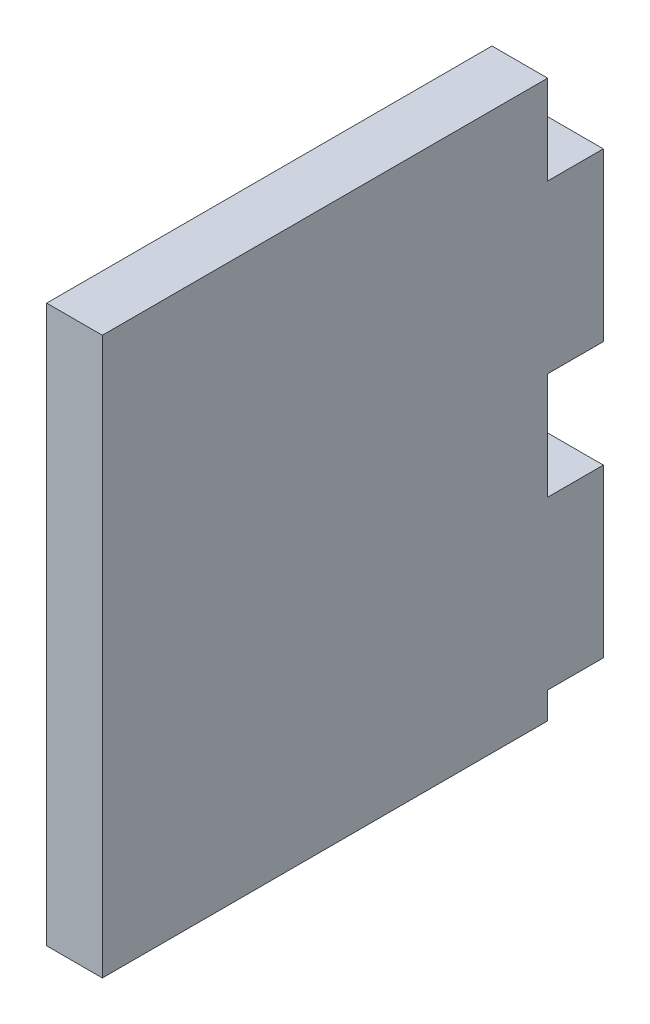
ISO-10303-21;
HEADER;
FILE_DESCRIPTION(('STEP AP214'),'2;1');
FILE_NAME('part.step','',(''),(''),'','','');
FILE_SCHEMA(('AUTOMOTIVE_DESIGN { 1 0 10303 214 1 1 1 1 }'));
ENDSEC;
DATA;
#1=APPLICATION_CONTEXT('core data for automotive mechanical design processes');
#2=APPLICATION_PROTOCOL_DEFINITION('international standard','automotive_design',2000,#1);
#3=PRODUCT_CONTEXT('',#1,'mechanical');
#4=PRODUCT('Part','Part','',(#3));
#5=PRODUCT_RELATED_PRODUCT_CATEGORY('part','',(#4));
#6=PRODUCT_DEFINITION_FORMATION('','',#4);
#7=PRODUCT_DEFINITION_CONTEXT('part definition',#1,'design');
#8=PRODUCT_DEFINITION('design','',#6,#7);
#9=PRODUCT_DEFINITION_SHAPE('','',#8);
#10=(LENGTH_UNIT() NAMED_UNIT(*) SI_UNIT(.MILLI.,.METRE.));
#11=(NAMED_UNIT(*) PLANE_ANGLE_UNIT() SI_UNIT($,.RADIAN.));
#12=(NAMED_UNIT(*) SI_UNIT($,.STERADIAN.) SOLID_ANGLE_UNIT());
#13=UNCERTAINTY_MEASURE_WITH_UNIT(LENGTH_MEASURE(1.E-05),#10,'distance_accuracy_value','');
#14=(GEOMETRIC_REPRESENTATION_CONTEXT(3) GLOBAL_UNCERTAINTY_ASSIGNED_CONTEXT((#13)) GLOBAL_UNIT_ASSIGNED_CONTEXT((#10,
#11,#12)) REPRESENTATION_CONTEXT('',''));
#15=CARTESIAN_POINT('',(0.,0.,0.));
#16=DIRECTION('',(0.,0.,1.));
#17=DIRECTION('',(1.,0.,0.));
#18=AXIS2_PLACEMENT_3D('',#15,#16,#17);
#19=CARTESIAN_POINT('',(5.,0.,-40.));
#20=DIRECTION('',(0.,0.,-1.));
#21=DIRECTION('',(0.,1.,0.));
#22=AXIS2_PLACEMENT_3D('',#19,#20,#21);
#23=PLANE('',#22);
#24=DIRECTION('',(0.,-1.,0.));
#25=VECTOR('',#24,1.);
#26=CARTESIAN_POINT('',(0.,0.,-40.));
#27=LINE('',#26,#25);
#28=CARTESIAN_POINT('',(0.,0.,-40.));
#29=VERTEX_POINT('',#28);
#30=CARTESIAN_POINT('',(0.,-8.,-40.));
#31=VERTEX_POINT('',#30);
#32=EDGE_CURVE('E164',#29,#31,#27,.T.);
#33=ORIENTED_EDGE('',*,*,#32,.F.);
#34=DIRECTION('',(-1.,0.,0.));
#35=VECTOR('',#34,1.);
#36=CARTESIAN_POINT('',(5.,0.,-40.));
#37=LINE('',#36,#35);
#38=CARTESIAN_POINT('',(5.,0.,-40.));
#39=VERTEX_POINT('',#38);
#40=EDGE_CURVE('E11',#39,#29,#37,.T.);
#41=ORIENTED_EDGE('',*,*,#40,.F.);
#42=DIRECTION('',(0.,-1.,0.));
#43=VECTOR('',#42,1.);
#44=CARTESIAN_POINT('',(5.,0.,-40.));
#45=LINE('',#44,#43);
#46=CARTESIAN_POINT('',(5.,-8.,-40.));
#47=VERTEX_POINT('',#46);
#48=EDGE_CURVE('E201',#39,#47,#45,.T.);
#49=ORIENTED_EDGE('',*,*,#48,.T.);
#50=DIRECTION('',(-1.,0.,0.));
#51=VECTOR('',#50,1.);
#52=CARTESIAN_POINT('',(5.,-8.,-40.));
#53=LINE('',#52,#51);
#54=EDGE_CURVE('E59',#47,#31,#53,.T.);
#55=ORIENTED_EDGE('',*,*,#54,.T.);
#56=EDGE_LOOP('',(#33,#41,#49,#55));
#57=FACE_BOUND('',#56,.T.);
#58=ADVANCED_FACE('F41',(#57),#23,.T.);
#59=CARTESIAN_POINT('',(5.,0.,0.));
#60=DIRECTION('',(0.,1.,0.));
#61=DIRECTION('',(0.,0.,1.));
#62=AXIS2_PLACEMENT_3D('',#59,#60,#61);
#63=PLANE('',#62);
#64=DIRECTION('',(0.,0.,-1.));
#65=VECTOR('',#64,1.);
#66=CARTESIAN_POINT('',(0.,0.,0.));
#67=LINE('',#66,#65);
#68=CARTESIAN_POINT('',(0.,0.,0.));
#69=VERTEX_POINT('',#68);
#70=EDGE_CURVE('E167',#69,#29,#67,.T.);
#71=ORIENTED_EDGE('',*,*,#70,.F.);
#72=DIRECTION('',(-1.,0.,0.));
#73=VECTOR('',#72,1.);
#74=CARTESIAN_POINT('',(5.,0.,0.));
#75=LINE('',#74,#73);
#76=CARTESIAN_POINT('',(5.,0.,0.));
#77=VERTEX_POINT('',#76);
#78=EDGE_CURVE('E51',#77,#69,#75,.T.);
#79=ORIENTED_EDGE('',*,*,#78,.F.);
#80=DIRECTION('',(0.,0.,-1.));
#81=VECTOR('',#80,1.);
#82=CARTESIAN_POINT('',(5.,0.,0.));
#83=LINE('',#82,#81);
#84=EDGE_CURVE('E241',#77,#39,#83,.T.);
#85=ORIENTED_EDGE('',*,*,#84,.T.);
#86=ORIENTED_EDGE('',*,*,#40,.T.);
#87=EDGE_LOOP('',(#71,#79,#85,#86));
#88=FACE_BOUND('',#87,.T.);
#89=ADVANCED_FACE('F43',(#88),#63,.T.);
#90=CARTESIAN_POINT('',(5.,0.,0.));
#91=DIRECTION('',(0.,0.,-1.));
#92=DIRECTION('',(-1.,0.,0.));
#93=AXIS2_PLACEMENT_3D('',#90,#91,#92);
#94=PLANE('',#93);
#95=DIRECTION('',(0.,-1.,0.));
#96=VECTOR('',#95,1.);
#97=CARTESIAN_POINT('',(0.,0.,0.));
#98=LINE('',#97,#96);
#99=CARTESIAN_POINT('',(0.,-50.,0.));
#100=VERTEX_POINT('',#99);
#101=EDGE_CURVE('E173',#69,#100,#98,.T.);
#102=ORIENTED_EDGE('',*,*,#101,.T.);
#103=DIRECTION('',(-1.,0.,0.));
#104=VECTOR('',#103,1.);
#105=CARTESIAN_POINT('',(5.,-50.,0.));
#106=LINE('',#105,#104);
#107=CARTESIAN_POINT('',(5.,-50.,0.));
#108=VERTEX_POINT('',#107);
#109=EDGE_CURVE('E223',#108,#100,#106,.T.);
#110=ORIENTED_EDGE('',*,*,#109,.F.);
#111=DIRECTION('',(0.,-1.,0.));
#112=VECTOR('',#111,1.);
#113=CARTESIAN_POINT('',(5.,0.,0.));
#114=LINE('',#113,#112);
#115=EDGE_CURVE('E232',#77,#108,#114,.T.);
#116=ORIENTED_EDGE('',*,*,#115,.F.);
#117=ORIENTED_EDGE('',*,*,#78,.T.);
#118=EDGE_LOOP('',(#102,#110,#116,#117));
#119=FACE_BOUND('',#118,.T.);
#120=ADVANCED_FACE('F230',(#119),#94,.F.);
#121=CARTESIAN_POINT('',(5.,-50.,0.));
#122=DIRECTION('',(0.,1.,0.));
#123=DIRECTION('',(0.,0.,1.));
#124=AXIS2_PLACEMENT_3D('',#121,#122,#123);
#125=PLANE('',#124);
#126=DIRECTION('',(0.,0.,-1.));
#127=VECTOR('',#126,1.);
#128=CARTESIAN_POINT('',(0.,-50.,0.));
#129=LINE('',#128,#127);
#130=CARTESIAN_POINT('',(0.,-50.,-40.));
#131=VERTEX_POINT('',#130);
#132=EDGE_CURVE('E176',#100,#131,#129,.T.);
#133=ORIENTED_EDGE('',*,*,#132,.T.);
#134=DIRECTION('',(-1.,0.,0.));
#135=VECTOR('',#134,1.);
#136=CARTESIAN_POINT('',(5.,-50.,-40.));
#137=LINE('',#136,#135);
#138=CARTESIAN_POINT('',(5.,-50.,-40.));
#139=VERTEX_POINT('',#138);
#140=EDGE_CURVE('E220',#139,#131,#137,.T.);
#141=ORIENTED_EDGE('',*,*,#140,.F.);
#142=DIRECTION('',(0.,0.,-1.));
#143=VECTOR('',#142,1.);
#144=CARTESIAN_POINT('',(5.,-50.,0.));
#145=LINE('',#144,#143);
#146=EDGE_CURVE('E288',#108,#139,#145,.T.);
#147=ORIENTED_EDGE('',*,*,#146,.F.);
#148=ORIENTED_EDGE('',*,*,#109,.T.);
#149=EDGE_LOOP('',(#133,#141,#147,#148));
#150=FACE_BOUND('',#149,.T.);
#151=ADVANCED_FACE('F263',(#150),#125,.F.);
#152=CARTESIAN_POINT('',(0.,-47.6,-40.));
#153=VERTEX_POINT('',#152);
#154=EDGE_CURVE('E169',#153,#131,#27,.T.);
#155=ORIENTED_EDGE('',*,*,#154,.F.);
#156=DIRECTION('',(-1.,0.,0.));
#157=VECTOR('',#156,1.);
#158=CARTESIAN_POINT('',(5.,-47.6,-40.));
#159=LINE('',#158,#157);
#160=CARTESIAN_POINT('',(5.,-47.6,-40.));
#161=VERTEX_POINT('',#160);
#162=EDGE_CURVE('E217',#161,#153,#159,.T.);
#163=ORIENTED_EDGE('',*,*,#162,.F.);
#164=EDGE_CURVE('E285',#161,#139,#45,.T.);
#165=ORIENTED_EDGE('',*,*,#164,.T.);
#166=ORIENTED_EDGE('',*,*,#140,.T.);
#167=EDGE_LOOP('',(#155,#163,#165,#166));
#168=FACE_BOUND('',#167,.T.);
#169=ADVANCED_FACE('F254',(#168),#23,.T.);
#170=CARTESIAN_POINT('',(5.,-47.6,0.));
#171=DIRECTION('',(0.,1.,0.));
#172=DIRECTION('',(0.,0.,1.));
#173=AXIS2_PLACEMENT_3D('',#170,#171,#172);
#174=PLANE('',#173);
#175=DIRECTION('',(0.,0.,-1.));
#176=VECTOR('',#175,1.);
#177=CARTESIAN_POINT('',(0.,-47.6,0.));
#178=LINE('',#177,#176);
#179=CARTESIAN_POINT('',(0.,-47.6,-45.));
#180=VERTEX_POINT('',#179);
#181=EDGE_CURVE('E180',#153,#180,#178,.T.);
#182=ORIENTED_EDGE('',*,*,#181,.T.);
#183=DIRECTION('',(-1.,0.,0.));
#184=VECTOR('',#183,1.);
#185=CARTESIAN_POINT('',(5.,-47.6,-45.));
#186=LINE('',#185,#184);
#187=CARTESIAN_POINT('',(5.,-47.6,-45.));
#188=VERTEX_POINT('',#187);
#189=EDGE_CURVE('E214',#188,#180,#186,.T.);
#190=ORIENTED_EDGE('',*,*,#189,.F.);
#191=DIRECTION('',(0.,0.,-1.));
#192=VECTOR('',#191,1.);
#193=CARTESIAN_POINT('',(5.,-47.6,0.));
#194=LINE('',#193,#192);
#195=EDGE_CURVE('E293',#161,#188,#194,.T.);
#196=ORIENTED_EDGE('',*,*,#195,.F.);
#197=ORIENTED_EDGE('',*,*,#162,.T.);
#198=EDGE_LOOP('',(#182,#190,#196,#197));
#199=FACE_BOUND('',#198,.T.);
#200=ADVANCED_FACE('F262',(#199),#174,.F.);
#201=CARTESIAN_POINT('',(5.,0.,-45.));
#202=DIRECTION('',(0.,0.,-1.));
#203=DIRECTION('',(0.,1.,0.));
#204=AXIS2_PLACEMENT_3D('',#201,#202,#203);
#205=PLANE('',#204);
#206=DIRECTION('',(0.,-1.,0.));
#207=VECTOR('',#206,1.);
#208=CARTESIAN_POINT('',(0.,0.,-45.));
#209=LINE('',#208,#207);
#210=CARTESIAN_POINT('',(0.,-32.6,-45.));
#211=VERTEX_POINT('',#210);
#212=EDGE_CURVE('E184',#211,#180,#209,.T.);
#213=ORIENTED_EDGE('',*,*,#212,.F.);
#214=DIRECTION('',(-1.,0.,0.));
#215=VECTOR('',#214,1.);
#216=CARTESIAN_POINT('',(5.,-32.6,-45.));
#217=LINE('',#216,#215);
#218=CARTESIAN_POINT('',(5.,-32.6,-45.));
#219=VERTEX_POINT('',#218);
#220=EDGE_CURVE('E211',#219,#211,#217,.T.);
#221=ORIENTED_EDGE('',*,*,#220,.F.);
#222=DIRECTION('',(0.,-1.,0.));
#223=VECTOR('',#222,1.);
#224=CARTESIAN_POINT('',(5.,0.,-45.));
#225=LINE('',#224,#223);
#226=EDGE_CURVE('E300',#219,#188,#225,.T.);
#227=ORIENTED_EDGE('',*,*,#226,.T.);
#228=ORIENTED_EDGE('',*,*,#189,.T.);
#229=EDGE_LOOP('',(#213,#221,#227,#228));
#230=FACE_BOUND('',#229,.T.);
#231=ADVANCED_FACE('F272',(#230),#205,.T.);
#232=CARTESIAN_POINT('',(5.,-32.6,0.));
#233=DIRECTION('',(0.,1.,0.));
#234=DIRECTION('',(0.,0.,1.));
#235=AXIS2_PLACEMENT_3D('',#232,#233,#234);
#236=PLANE('',#235);
#237=DIRECTION('',(0.,0.,-1.));
#238=VECTOR('',#237,1.);
#239=CARTESIAN_POINT('',(0.,-32.6,0.));
#240=LINE('',#239,#238);
#241=CARTESIAN_POINT('',(0.,-32.6,-40.));
#242=VERTEX_POINT('',#241);
#243=EDGE_CURVE('E188',#242,#211,#240,.T.);
#244=ORIENTED_EDGE('',*,*,#243,.F.);
#245=DIRECTION('',(-1.,0.,0.));
#246=VECTOR('',#245,1.);
#247=CARTESIAN_POINT('',(5.,-32.6,-40.));
#248=LINE('',#247,#246);
#249=CARTESIAN_POINT('',(5.,-32.6,-40.));
#250=VERTEX_POINT('',#249);
#251=EDGE_CURVE('E208',#250,#242,#248,.T.);
#252=ORIENTED_EDGE('',*,*,#251,.F.);
#253=DIRECTION('',(0.,0.,-1.));
#254=VECTOR('',#253,1.);
#255=CARTESIAN_POINT('',(5.,-32.6,0.));
#256=LINE('',#255,#254);
#257=EDGE_CURVE('E303',#250,#219,#256,.T.);
#258=ORIENTED_EDGE('',*,*,#257,.T.);
#259=ORIENTED_EDGE('',*,*,#220,.T.);
#260=EDGE_LOOP('',(#244,#252,#258,#259));
#261=FACE_BOUND('',#260,.T.);
#262=ADVANCED_FACE('F266',(#261),#236,.T.);
#263=CARTESIAN_POINT('',(0.,-23.,-40.));
#264=VERTEX_POINT('',#263);
#265=EDGE_CURVE('E168',#264,#242,#27,.T.);
#266=ORIENTED_EDGE('',*,*,#265,.F.);
#267=DIRECTION('',(-1.,0.,0.));
#268=VECTOR('',#267,1.);
#269=CARTESIAN_POINT('',(5.,-23.,-40.));
#270=LINE('',#269,#268);
#271=CARTESIAN_POINT('',(5.,-23.,-40.));
#272=VERTEX_POINT('',#271);
#273=EDGE_CURVE('E154',#272,#264,#270,.T.);
#274=ORIENTED_EDGE('',*,*,#273,.F.);
#275=EDGE_CURVE('E142',#272,#250,#45,.T.);
#276=ORIENTED_EDGE('',*,*,#275,.T.);
#277=ORIENTED_EDGE('',*,*,#251,.T.);
#278=EDGE_LOOP('',(#266,#274,#276,#277));
#279=FACE_BOUND('',#278,.T.);
#280=ADVANCED_FACE('F255',(#279),#23,.T.);
#281=CARTESIAN_POINT('',(5.,-23.,0.));
#282=DIRECTION('',(0.,1.,0.));
#283=DIRECTION('',(0.,0.,1.));
#284=AXIS2_PLACEMENT_3D('',#281,#282,#283);
#285=PLANE('',#284);
#286=DIRECTION('',(0.,0.,-1.));
#287=VECTOR('',#286,1.);
#288=CARTESIAN_POINT('',(0.,-23.,0.));
#289=LINE('',#288,#287);
#290=CARTESIAN_POINT('',(0.,-23.,-45.));
#291=VERTEX_POINT('',#290);
#292=EDGE_CURVE('E150',#264,#291,#289,.T.);
#293=ORIENTED_EDGE('',*,*,#292,.T.);
#294=DIRECTION('',(-1.,0.,0.));
#295=VECTOR('',#294,1.);
#296=CARTESIAN_POINT('',(5.,-23.,-45.));
#297=LINE('',#296,#295);
#298=CARTESIAN_POINT('',(5.,-23.,-45.));
#299=VERTEX_POINT('',#298);
#300=EDGE_CURVE('E147',#299,#291,#297,.T.);
#301=ORIENTED_EDGE('',*,*,#300,.F.);
#302=DIRECTION('',(0.,0.,-1.));
#303=VECTOR('',#302,1.);
#304=CARTESIAN_POINT('',(5.,-23.,0.));
#305=LINE('',#304,#303);
#306=EDGE_CURVE('E134',#272,#299,#305,.T.);
#307=ORIENTED_EDGE('',*,*,#306,.F.);
#308=ORIENTED_EDGE('',*,*,#273,.T.);
#309=EDGE_LOOP('',(#293,#301,#307,#308));
#310=FACE_BOUND('',#309,.T.);
#311=ADVANCED_FACE('F148',(#310),#285,.F.);
#312=CARTESIAN_POINT('',(5.,0.,-45.));
#313=DIRECTION('',(0.,0.,-1.));
#314=DIRECTION('',(0.,1.,0.));
#315=AXIS2_PLACEMENT_3D('',#312,#313,#314);
#316=PLANE('',#315);
#317=DIRECTION('',(0.,-1.,0.));
#318=VECTOR('',#317,1.);
#319=CARTESIAN_POINT('',(0.,0.,-45.));
#320=LINE('',#319,#318);
#321=CARTESIAN_POINT('',(0.,-8.,-45.));
#322=VERTEX_POINT('',#321);
#323=EDGE_CURVE('E194',#322,#291,#320,.T.);
#324=ORIENTED_EDGE('',*,*,#323,.F.);
#325=DIRECTION('',(-1.,0.,0.));
#326=VECTOR('',#325,1.);
#327=CARTESIAN_POINT('',(5.,-8.,-45.));
#328=LINE('',#327,#326);
#329=CARTESIAN_POINT('',(5.,-8.,-45.));
#330=VERTEX_POINT('',#329);
#331=EDGE_CURVE('E96',#330,#322,#328,.T.);
#332=ORIENTED_EDGE('',*,*,#331,.F.);
#333=DIRECTION('',(0.,-1.,0.));
#334=VECTOR('',#333,1.);
#335=CARTESIAN_POINT('',(5.,0.,-45.));
#336=LINE('',#335,#334);
#337=EDGE_CURVE('E139',#330,#299,#336,.T.);
#338=ORIENTED_EDGE('',*,*,#337,.T.);
#339=ORIENTED_EDGE('',*,*,#300,.T.);
#340=EDGE_LOOP('',(#324,#332,#338,#339));
#341=FACE_BOUND('',#340,.T.);
#342=ADVANCED_FACE('F156',(#341),#316,.T.);
#343=CARTESIAN_POINT('',(5.,-8.,0.));
#344=DIRECTION('',(0.,1.,0.));
#345=DIRECTION('',(0.,0.,1.));
#346=AXIS2_PLACEMENT_3D('',#343,#344,#345);
#347=PLANE('',#346);
#348=DIRECTION('',(0.,0.,-1.));
#349=VECTOR('',#348,1.);
#350=CARTESIAN_POINT('',(0.,-8.,0.));
#351=LINE('',#350,#349);
#352=EDGE_CURVE('E197',#31,#322,#351,.T.);
#353=ORIENTED_EDGE('',*,*,#352,.F.);
#354=ORIENTED_EDGE('',*,*,#54,.F.);
#355=DIRECTION('',(0.,0.,-1.));
#356=VECTOR('',#355,1.);
#357=CARTESIAN_POINT('',(5.,-8.,0.));
#358=LINE('',#357,#356);
#359=EDGE_CURVE('E158',#47,#330,#358,.T.);
#360=ORIENTED_EDGE('',*,*,#359,.T.);
#361=ORIENTED_EDGE('',*,*,#331,.T.);
#362=EDGE_LOOP('',(#353,#354,#360,#361));
#363=FACE_BOUND('',#362,.T.);
#364=ADVANCED_FACE('F242',(#363),#347,.T.);
#365=CARTESIAN_POINT('',(5.,0.,0.));
#366=DIRECTION('',(1.,0.,0.));
#367=DIRECTION('',(0.,0.,-1.));
#368=AXIS2_PLACEMENT_3D('',#365,#366,#367);
#369=PLANE('',#368);
#370=ORIENTED_EDGE('',*,*,#48,.F.);
#371=ORIENTED_EDGE('',*,*,#84,.F.);
#372=ORIENTED_EDGE('',*,*,#115,.T.);
#373=ORIENTED_EDGE('',*,*,#146,.T.);
#374=ORIENTED_EDGE('',*,*,#164,.F.);
#375=ORIENTED_EDGE('',*,*,#195,.T.);
#376=ORIENTED_EDGE('',*,*,#226,.F.);
#377=ORIENTED_EDGE('',*,*,#257,.F.);
#378=ORIENTED_EDGE('',*,*,#275,.F.);
#379=ORIENTED_EDGE('',*,*,#306,.T.);
#380=ORIENTED_EDGE('',*,*,#337,.F.);
#381=ORIENTED_EDGE('',*,*,#359,.F.);
#382=EDGE_LOOP('',(#370,#371,#372,#373,#374,#375,#376,#377,#378,#379,#380,#381));
#383=FACE_BOUND('',#382,.T.);
#384=ADVANCED_FACE('F136',(#383),#369,.T.);
#385=CARTESIAN_POINT('',(0.,0.,0.));
#386=DIRECTION('',(1.,0.,0.));
#387=DIRECTION('',(0.,0.,-1.));
#388=AXIS2_PLACEMENT_3D('',#385,#386,#387);
#389=PLANE('',#388);
#390=ORIENTED_EDGE('',*,*,#32,.T.);
#391=ORIENTED_EDGE('',*,*,#352,.T.);
#392=ORIENTED_EDGE('',*,*,#323,.T.);
#393=ORIENTED_EDGE('',*,*,#292,.F.);
#394=ORIENTED_EDGE('',*,*,#265,.T.);
#395=ORIENTED_EDGE('',*,*,#243,.T.);
#396=ORIENTED_EDGE('',*,*,#212,.T.);
#397=ORIENTED_EDGE('',*,*,#181,.F.);
#398=ORIENTED_EDGE('',*,*,#154,.T.);
#399=ORIENTED_EDGE('',*,*,#132,.F.);
#400=ORIENTED_EDGE('',*,*,#101,.F.);
#401=ORIENTED_EDGE('',*,*,#70,.T.);
#402=EDGE_LOOP('',(#390,#391,#392,#393,#394,#395,#396,#397,#398,#399,#400,#401));
#403=FACE_BOUND('',#402,.T.);
#404=ADVANCED_FACE('F239',(#403),#389,.F.);
#405=CLOSED_SHELL('',(#58,#89,#120,#151,#169,#200,#231,#262,#280,#311,#342,#364,#384,#404));
#406=MANIFOLD_SOLID_BREP('B2',#405);
#407=ADVANCED_BREP_SHAPE_REPRESENTATION('',(#18,#406),#14);
#408=SHAPE_DEFINITION_REPRESENTATION(#9,#407);
ENDSEC;
END-ISO-10303-21;
